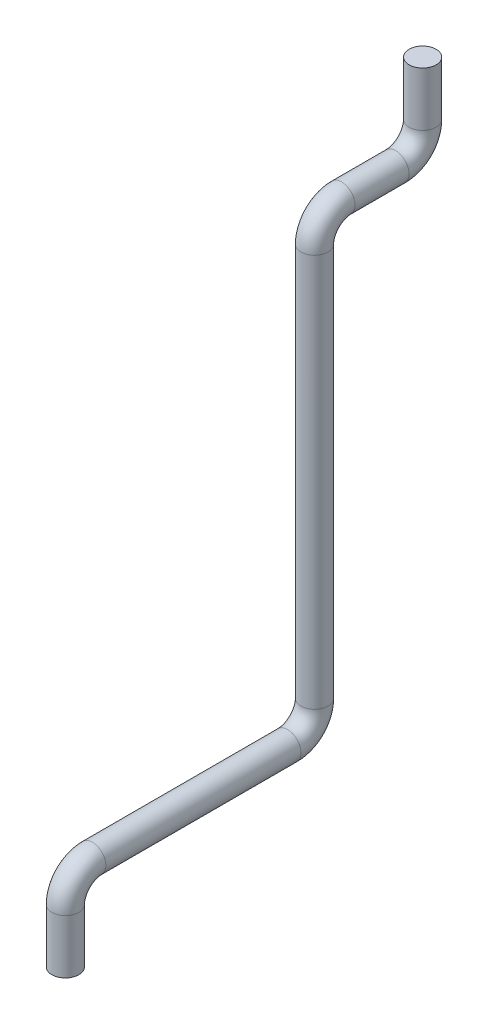
ISO-10303-21;
HEADER;
FILE_DESCRIPTION(('STEP AP214'),'2;1');
FILE_NAME('part.step','',(''),(''),'','','');
FILE_SCHEMA(('AUTOMOTIVE_DESIGN { 1 0 10303 214 1 1 1 1 }'));
ENDSEC;
DATA;
#1=APPLICATION_CONTEXT('core data for automotive mechanical design processes');
#2=APPLICATION_PROTOCOL_DEFINITION('international standard','automotive_design',2000,#1);
#3=PRODUCT_CONTEXT('',#1,'mechanical');
#4=PRODUCT('Part','Part','',(#3));
#5=PRODUCT_RELATED_PRODUCT_CATEGORY('part','',(#4));
#6=PRODUCT_DEFINITION_FORMATION('','',#4);
#7=PRODUCT_DEFINITION_CONTEXT('part definition',#1,'design');
#8=PRODUCT_DEFINITION('design','',#6,#7);
#9=PRODUCT_DEFINITION_SHAPE('','',#8);
#10=(LENGTH_UNIT() NAMED_UNIT(*) SI_UNIT(.MILLI.,.METRE.));
#11=(NAMED_UNIT(*) PLANE_ANGLE_UNIT() SI_UNIT($,.RADIAN.));
#12=(NAMED_UNIT(*) SI_UNIT($,.STERADIAN.) SOLID_ANGLE_UNIT());
#13=UNCERTAINTY_MEASURE_WITH_UNIT(LENGTH_MEASURE(1.E-05),#10,'distance_accuracy_value','');
#14=(GEOMETRIC_REPRESENTATION_CONTEXT(3) GLOBAL_UNCERTAINTY_ASSIGNED_CONTEXT((#13)) GLOBAL_UNIT_ASSIGNED_CONTEXT((#10,
#11,#12)) REPRESENTATION_CONTEXT('',''));
#15=CARTESIAN_POINT('',(0.,0.,0.));
#16=DIRECTION('',(0.,0.,1.));
#17=DIRECTION('',(1.,0.,0.));
#18=AXIS2_PLACEMENT_3D('',#15,#16,#17);
#19=CARTESIAN_POINT('',(0.,20.55,-13.22));
#20=DIRECTION('',(0.,1.,0.));
#21=DIRECTION('',(0.,0.,1.));
#22=AXIS2_PLACEMENT_3D('',#19,#20,#21);
#23=CYLINDRICAL_SURFACE('',#22,0.5);
#24=CARTESIAN_POINT('',(0.,20.55,-13.22));
#25=DIRECTION('',(0.,1.,0.));
#26=DIRECTION('',(0.,0.,1.));
#27=AXIS2_PLACEMENT_3D('',#24,#25,#26);
#28=CIRCLE('',#27,0.5);
#29=CARTESIAN_POINT('',(0.,20.55,-13.72));
#30=VERTEX_POINT('',#29);
#31=EDGE_CURVE('E37',#30,#30,#28,.T.);
#32=ORIENTED_EDGE('',*,*,#31,.T.);
#33=EDGE_LOOP('',(#32));
#34=FACE_BOUND('',#33,.T.);
#35=CARTESIAN_POINT('',(0.,22.55,-13.22));
#36=DIRECTION('',(0.,1.,0.));
#37=DIRECTION('',(0.,0.,1.));
#38=AXIS2_PLACEMENT_3D('',#35,#36,#37);
#39=CIRCLE('',#38,0.5);
#40=CARTESIAN_POINT('',(0.,22.55,-12.72));
#41=VERTEX_POINT('',#40);
#42=EDGE_CURVE('E10',#41,#41,#39,.T.);
#43=ORIENTED_EDGE('',*,*,#42,.F.);
#44=EDGE_LOOP('',(#43));
#45=FACE_BOUND('',#44,.T.);
#46=ADVANCED_FACE('F31',(#34,#45),#23,.T.);
#47=CARTESIAN_POINT('',(0.,20.55,-12.22));
#48=DIRECTION('',(1.,0.,0.));
#49=DIRECTION('',(0.,0.,-1.));
#50=AXIS2_PLACEMENT_3D('',#47,#48,#49);
#51=TOROIDAL_SURFACE('',#50,1.,0.5);
#52=CARTESIAN_POINT('',(0.,19.55,-12.22));
#53=DIRECTION('',(0.,0.,-1.));
#54=DIRECTION('',(0.,1.,0.));
#55=AXIS2_PLACEMENT_3D('',#52,#53,#54);
#56=CIRCLE('',#55,0.5);
#57=CARTESIAN_POINT('',(0.,19.05,-12.22));
#58=VERTEX_POINT('',#57);
#59=EDGE_CURVE('E41',#58,#58,#56,.T.);
#60=CARTESIAN_POINT('',(0.,20.55,-12.22));
#61=DIRECTION('',(1.,0.,0.));
#62=DIRECTION('',(0.,0.,-1.));
#63=AXIS2_PLACEMENT_3D('',#60,#61,#62);
#64=CIRCLE('',#63,1.5);
#65=EDGE_CURVE('',#58,#30,#64,.T.);
#66=ORIENTED_EDGE('',*,*,#59,.T.);
#67=ORIENTED_EDGE('',*,*,#31,.F.);
#68=ORIENTED_EDGE('',*,*,#65,.T.);
#69=ORIENTED_EDGE('',*,*,#65,.F.);
#70=EDGE_LOOP('',(#66,#68,#67,#69));
#71=FACE_BOUND('',#70,.T.);
#72=ADVANCED_FACE('F87',(#71),#51,.T.);
#73=CARTESIAN_POINT('',(0.,19.55,-10.22));
#74=DIRECTION('',(0.,0.,-1.));
#75=DIRECTION('',(-1.,0.,0.));
#76=AXIS2_PLACEMENT_3D('',#73,#74,#75);
#77=CYLINDRICAL_SURFACE('',#76,0.5);
#78=CARTESIAN_POINT('',(0.,19.55,-10.22));
#79=DIRECTION('',(0.,0.,-1.));
#80=DIRECTION('',(0.,1.,0.));
#81=AXIS2_PLACEMENT_3D('',#78,#79,#80);
#82=CIRCLE('',#81,0.5);
#83=CARTESIAN_POINT('',(0.,20.05,-10.22));
#84=VERTEX_POINT('',#83);
#85=EDGE_CURVE('E45',#84,#84,#82,.T.);
#86=ORIENTED_EDGE('',*,*,#85,.T.);
#87=EDGE_LOOP('',(#86));
#88=FACE_BOUND('',#87,.T.);
#89=ORIENTED_EDGE('',*,*,#59,.F.);
#90=EDGE_LOOP('',(#89));
#91=FACE_BOUND('',#90,.T.);
#92=ADVANCED_FACE('F91',(#88,#91),#77,.T.);
#93=CARTESIAN_POINT('',(0.,18.55,-10.22));
#94=DIRECTION('',(-1.,0.,0.));
#95=DIRECTION('',(0.,0.,1.));
#96=AXIS2_PLACEMENT_3D('',#93,#94,#95);
#97=TOROIDAL_SURFACE('',#96,1.,0.5);
#98=CARTESIAN_POINT('',(0.,18.55,-9.22));
#99=DIRECTION('',(0.,1.,0.));
#100=DIRECTION('',(0.,0.,1.));
#101=AXIS2_PLACEMENT_3D('',#98,#99,#100);
#102=CIRCLE('',#101,0.5);
#103=CARTESIAN_POINT('',(0.,18.55,-8.72));
#104=VERTEX_POINT('',#103);
#105=EDGE_CURVE('E50',#104,#104,#102,.T.);
#106=CARTESIAN_POINT('',(0.,18.55,-10.22));
#107=DIRECTION('',(-1.,0.,0.));
#108=DIRECTION('',(0.,0.,1.));
#109=AXIS2_PLACEMENT_3D('',#106,#107,#108);
#110=CIRCLE('',#109,1.5);
#111=EDGE_CURVE('',#104,#84,#110,.T.);
#112=ORIENTED_EDGE('',*,*,#105,.T.);
#113=ORIENTED_EDGE('',*,*,#85,.F.);
#114=ORIENTED_EDGE('',*,*,#111,.T.);
#115=ORIENTED_EDGE('',*,*,#111,.F.);
#116=EDGE_LOOP('',(#112,#114,#113,#115));
#117=FACE_BOUND('',#116,.T.);
#118=ADVANCED_FACE('F97',(#117),#97,.T.);
#119=CARTESIAN_POINT('',(0.,4.,-9.22));
#120=DIRECTION('',(0.,1.,0.));
#121=DIRECTION('',(0.,0.,1.));
#122=AXIS2_PLACEMENT_3D('',#119,#120,#121);
#123=CYLINDRICAL_SURFACE('',#122,0.5);
#124=CARTESIAN_POINT('',(0.,4.,-9.22));
#125=DIRECTION('',(0.,1.,0.));
#126=DIRECTION('',(0.,0.,1.));
#127=AXIS2_PLACEMENT_3D('',#124,#125,#126);
#128=CIRCLE('',#127,0.5);
#129=CARTESIAN_POINT('',(0.,4.,-9.72));
#130=VERTEX_POINT('',#129);
#131=EDGE_CURVE('E53',#130,#130,#128,.T.);
#132=ORIENTED_EDGE('',*,*,#131,.T.);
#133=EDGE_LOOP('',(#132));
#134=FACE_BOUND('',#133,.T.);
#135=ORIENTED_EDGE('',*,*,#105,.F.);
#136=EDGE_LOOP('',(#135));
#137=FACE_BOUND('',#136,.T.);
#138=ADVANCED_FACE('F104',(#134,#137),#123,.T.);
#139=CARTESIAN_POINT('',(0.,4.,-8.22));
#140=DIRECTION('',(1.,0.,0.));
#141=DIRECTION('',(0.,0.,-1.));
#142=AXIS2_PLACEMENT_3D('',#139,#140,#141);
#143=TOROIDAL_SURFACE('',#142,1.,0.5);
#144=CARTESIAN_POINT('',(0.,3.,-8.22));
#145=DIRECTION('',(0.,0.,-1.));
#146=DIRECTION('',(0.,1.,0.));
#147=AXIS2_PLACEMENT_3D('',#144,#145,#146);
#148=CIRCLE('',#147,0.5);
#149=CARTESIAN_POINT('',(0.,2.5,-8.22));
#150=VERTEX_POINT('',#149);
#151=EDGE_CURVE('E56',#150,#150,#148,.T.);
#152=CARTESIAN_POINT('',(0.,4.,-8.22));
#153=DIRECTION('',(1.,0.,0.));
#154=DIRECTION('',(0.,0.,-1.));
#155=AXIS2_PLACEMENT_3D('',#152,#153,#154);
#156=CIRCLE('',#155,1.5);
#157=EDGE_CURVE('',#150,#130,#156,.T.);
#158=ORIENTED_EDGE('',*,*,#151,.T.);
#159=ORIENTED_EDGE('',*,*,#131,.F.);
#160=ORIENTED_EDGE('',*,*,#157,.T.);
#161=ORIENTED_EDGE('',*,*,#157,.F.);
#162=EDGE_LOOP('',(#158,#160,#159,#161));
#163=FACE_BOUND('',#162,.T.);
#164=ADVANCED_FACE('F108',(#163),#143,.T.);
#165=CARTESIAN_POINT('',(0.,3.,-1.00000000000001));
#166=DIRECTION('',(0.,0.,-1.));
#167=DIRECTION('',(-1.,0.,0.));
#168=AXIS2_PLACEMENT_3D('',#165,#166,#167);
#169=CYLINDRICAL_SURFACE('',#168,0.5);
#170=CARTESIAN_POINT('',(0.,3.,-1.00000000000001));
#171=DIRECTION('',(0.,0.,-1.));
#172=DIRECTION('',(0.,1.,0.));
#173=AXIS2_PLACEMENT_3D('',#170,#171,#172);
#174=CIRCLE('',#173,0.5);
#175=CARTESIAN_POINT('',(0.,3.5,-1.00000000000001));
#176=VERTEX_POINT('',#175);
#177=EDGE_CURVE('E59',#176,#176,#174,.T.);
#178=ORIENTED_EDGE('',*,*,#177,.T.);
#179=EDGE_LOOP('',(#178));
#180=FACE_BOUND('',#179,.T.);
#181=ORIENTED_EDGE('',*,*,#151,.F.);
#182=EDGE_LOOP('',(#181));
#183=FACE_BOUND('',#182,.T.);
#184=ADVANCED_FACE('F112',(#180,#183),#169,.T.);
#185=CARTESIAN_POINT('',(0.,2.,-1.));
#186=DIRECTION('',(-1.,0.,0.));
#187=DIRECTION('',(0.,0.,1.));
#188=AXIS2_PLACEMENT_3D('',#185,#186,#187);
#189=TOROIDAL_SURFACE('',#188,1.,0.5);
#190=CARTESIAN_POINT('',(0.,1.99999999999999,0.));
#191=DIRECTION('',(0.,1.,0.));
#192=DIRECTION('',(0.,0.,1.));
#193=AXIS2_PLACEMENT_3D('',#190,#191,#192);
#194=CIRCLE('',#193,0.5);
#195=CARTESIAN_POINT('',(0.,1.99999999999999,0.5));
#196=VERTEX_POINT('',#195);
#197=EDGE_CURVE('E62',#196,#196,#194,.T.);
#198=CARTESIAN_POINT('',(0.,2.,-1.));
#199=DIRECTION('',(-1.,0.,0.));
#200=DIRECTION('',(0.,0.,1.));
#201=AXIS2_PLACEMENT_3D('',#198,#199,#200);
#202=CIRCLE('',#201,1.5);
#203=EDGE_CURVE('',#196,#176,#202,.T.);
#204=ORIENTED_EDGE('',*,*,#197,.T.);
#205=ORIENTED_EDGE('',*,*,#177,.F.);
#206=ORIENTED_EDGE('',*,*,#203,.T.);
#207=ORIENTED_EDGE('',*,*,#203,.F.);
#208=EDGE_LOOP('',(#204,#206,#205,#207));
#209=FACE_BOUND('',#208,.T.);
#210=ADVANCED_FACE('F69',(#209),#189,.T.);
#211=CARTESIAN_POINT('',(0.,1.99999999999999,0.));
#212=DIRECTION('',(0.,-1.,0.));
#213=DIRECTION('',(0.,0.,-1.));
#214=AXIS2_PLACEMENT_3D('',#211,#212,#213);
#215=CYLINDRICAL_SURFACE('',#214,0.5);
#216=ORIENTED_EDGE('',*,*,#197,.F.);
#217=EDGE_LOOP('',(#216));
#218=FACE_BOUND('',#217,.T.);
#219=CARTESIAN_POINT('',(0.,0.,0.));
#220=DIRECTION('',(0.,1.,0.));
#221=DIRECTION('',(0.,0.,1.));
#222=AXIS2_PLACEMENT_3D('',#219,#220,#221);
#223=CIRCLE('',#222,0.5);
#224=CARTESIAN_POINT('',(0.,0.,0.5));
#225=VERTEX_POINT('',#224);
#226=EDGE_CURVE('E63',#225,#225,#223,.T.);
#227=ORIENTED_EDGE('',*,*,#226,.T.);
#228=EDGE_LOOP('',(#227));
#229=FACE_BOUND('',#228,.T.);
#230=ADVANCED_FACE('F72',(#218,#229),#215,.T.);
#231=CARTESIAN_POINT('',(0.,22.55,-13.22));
#232=DIRECTION('',(0.,1.,0.));
#233=DIRECTION('',(0.,0.,1.));
#234=AXIS2_PLACEMENT_3D('',#231,#232,#233);
#235=PLANE('',#234);
#236=ORIENTED_EDGE('',*,*,#42,.T.);
#237=EDGE_LOOP('',(#236));
#238=FACE_BOUND('',#237,.T.);
#239=ADVANCED_FACE('F75',(#238),#235,.T.);
#240=CARTESIAN_POINT('',(0.,0.,0.));
#241=DIRECTION('',(0.,1.,0.));
#242=DIRECTION('',(0.,0.,1.));
#243=AXIS2_PLACEMENT_3D('',#240,#241,#242);
#244=PLANE('',#243);
#245=ORIENTED_EDGE('',*,*,#226,.F.);
#246=EDGE_LOOP('',(#245));
#247=FACE_BOUND('',#246,.T.);
#248=ADVANCED_FACE('F79',(#247),#244,.F.);
#249=CLOSED_SHELL('',(#46,#72,#92,#118,#138,#164,#184,#210,#230,#239,#248));
#250=MANIFOLD_SOLID_BREP('B2',#249);
#251=ADVANCED_BREP_SHAPE_REPRESENTATION('',(#18,#250),#14);
#252=SHAPE_DEFINITION_REPRESENTATION(#9,#251);
ENDSEC;
END-ISO-10303-21;
